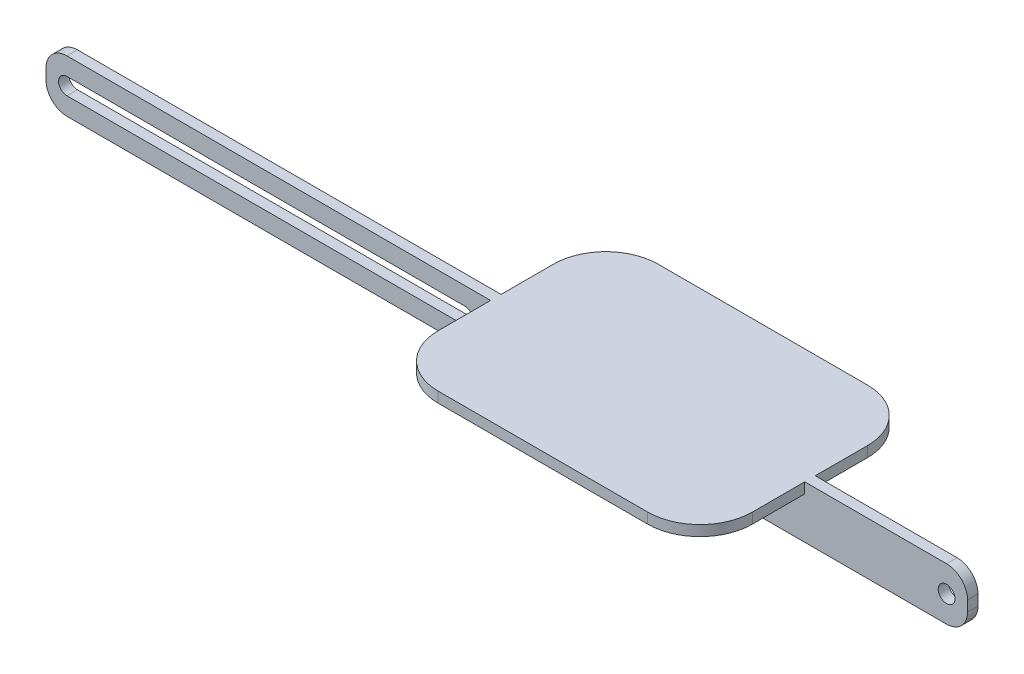
ISO-10303-21;
HEADER;
FILE_DESCRIPTION(('STEP AP214'),'2;1');
FILE_NAME('part.step','',(''),(''),'','','');
FILE_SCHEMA(('AUTOMOTIVE_DESIGN { 1 0 10303 214 1 1 1 1 }'));
ENDSEC;
DATA;
#1=APPLICATION_CONTEXT('core data for automotive mechanical design processes');
#2=APPLICATION_PROTOCOL_DEFINITION('international standard','automotive_design',2000,#1);
#3=PRODUCT_CONTEXT('',#1,'mechanical');
#4=PRODUCT('Part','Part','',(#3));
#5=PRODUCT_RELATED_PRODUCT_CATEGORY('part','',(#4));
#6=PRODUCT_DEFINITION_FORMATION('','',#4);
#7=PRODUCT_DEFINITION_CONTEXT('part definition',#1,'design');
#8=PRODUCT_DEFINITION('design','',#6,#7);
#9=PRODUCT_DEFINITION_SHAPE('','',#8);
#10=(LENGTH_UNIT() NAMED_UNIT(*) SI_UNIT(.MILLI.,.METRE.));
#11=(NAMED_UNIT(*) PLANE_ANGLE_UNIT() SI_UNIT($,.RADIAN.));
#12=(NAMED_UNIT(*) SI_UNIT($,.STERADIAN.) SOLID_ANGLE_UNIT());
#13=UNCERTAINTY_MEASURE_WITH_UNIT(LENGTH_MEASURE(1.E-05),#10,'distance_accuracy_value','');
#14=(GEOMETRIC_REPRESENTATION_CONTEXT(3) GLOBAL_UNCERTAINTY_ASSIGNED_CONTEXT((#13)) GLOBAL_UNIT_ASSIGNED_CONTEXT((#10,
#11,#12)) REPRESENTATION_CONTEXT('',''));
#15=CARTESIAN_POINT('',(0.,0.,0.));
#16=DIRECTION('',(0.,0.,1.));
#17=DIRECTION('',(1.,0.,0.));
#18=AXIS2_PLACEMENT_3D('',#15,#16,#17);
#19=CARTESIAN_POINT('',(53.3332747335424,2.49999999999998,5.));
#20=DIRECTION('',(0.,0.,1.));
#21=DIRECTION('',(1.,0.,0.));
#22=AXIS2_PLACEMENT_3D('',#19,#20,#21);
#23=PLANE('',#22);
#24=DIRECTION('',(0.,1.,0.));
#25=VECTOR('',#24,1.);
#26=CARTESIAN_POINT('',(-14.38994378085,2.49999999999998,5.));
#27=LINE('',#26,#25);
#28=CARTESIAN_POINT('',(-14.38994378085,7.5,5.));
#29=VERTEX_POINT('',#28);
#30=CARTESIAN_POINT('',(-14.38994378085,12.5,5.));
#31=VERTEX_POINT('',#30);
#32=EDGE_CURVE('E205',#29,#31,#27,.T.);
#33=ORIENTED_EDGE('',*,*,#32,.F.);
#34=DIRECTION('',(1.,0.,0.));
#35=VECTOR('',#34,1.);
#36=CARTESIAN_POINT('',(53.3332747335424,7.5,5.));
#37=LINE('',#36,#35);
#38=CARTESIAN_POINT('',(-164.38994378085,7.5,5.));
#39=VERTEX_POINT('',#38);
#40=EDGE_CURVE('E199',#39,#29,#37,.T.);
#41=ORIENTED_EDGE('',*,*,#40,.F.);
#42=DIRECTION('',(0.,-1.,0.));
#43=VECTOR('',#42,1.);
#44=CARTESIAN_POINT('',(-164.38994378085,2.49999999999998,5.));
#45=LINE('',#44,#43);
#46=CARTESIAN_POINT('',(-164.38994378085,12.5,5.));
#47=VERTEX_POINT('',#46);
#48=EDGE_CURVE('E202',#47,#39,#45,.T.);
#49=ORIENTED_EDGE('',*,*,#48,.F.);
#50=DIRECTION('',(-1.,0.,0.));
#51=VECTOR('',#50,1.);
#52=CARTESIAN_POINT('',(-126.666725266458,12.5,5.));
#53=LINE('',#52,#51);
#54=CARTESIAN_POINT('',(-366.666725266458,12.5,5.));
#55=VERTEX_POINT('',#54);
#56=EDGE_CURVE('E281',#47,#55,#53,.T.);
#57=ORIENTED_EDGE('',*,*,#56,.T.);
#58=CARTESIAN_POINT('',(-366.666725266458,2.49999999999999,5.));
#59=DIRECTION('',(0.,0.,1.));
#60=DIRECTION('',(-1.,0.,0.));
#61=AXIS2_PLACEMENT_3D('',#58,#59,#60);
#62=CIRCLE('',#61,10.);
#63=CARTESIAN_POINT('',(-376.666725266458,2.49999999999999,5.));
#64=VERTEX_POINT('',#63);
#65=EDGE_CURVE('E280',#55,#64,#62,.T.);
#66=ORIENTED_EDGE('',*,*,#65,.T.);
#67=DIRECTION('',(0.,-1.,0.));
#68=VECTOR('',#67,1.);
#69=CARTESIAN_POINT('',(-376.666725266458,2.49999999999999,5.));
#70=LINE('',#69,#68);
#71=CARTESIAN_POINT('',(-376.666725266458,-2.49999999999999,5.));
#72=VERTEX_POINT('',#71);
#73=EDGE_CURVE('E283',#64,#72,#70,.T.);
#74=ORIENTED_EDGE('',*,*,#73,.T.);
#75=CARTESIAN_POINT('',(-366.666725266458,-2.49999999999999,5.));
#76=DIRECTION('',(0.,0.,1.));
#77=DIRECTION('',(1.,0.,0.));
#78=AXIS2_PLACEMENT_3D('',#75,#76,#77);
#79=CIRCLE('',#78,10.);
#80=CARTESIAN_POINT('',(-366.666725266458,-12.5,5.));
#81=VERTEX_POINT('',#80);
#82=EDGE_CURVE('E285',#72,#81,#79,.T.);
#83=ORIENTED_EDGE('',*,*,#82,.T.);
#84=DIRECTION('',(1.,0.,0.));
#85=VECTOR('',#84,1.);
#86=CARTESIAN_POINT('',(-366.666725266458,-12.5,5.));
#87=LINE('',#86,#85);
#88=CARTESIAN_POINT('',(53.3332747335424,-12.5,5.));
#89=VERTEX_POINT('',#88);
#90=EDGE_CURVE('E287',#81,#89,#87,.T.);
#91=ORIENTED_EDGE('',*,*,#90,.T.);
#92=CARTESIAN_POINT('',(53.3332747335424,-2.49999999999998,5.));
#93=DIRECTION('',(0.,0.,1.));
#94=DIRECTION('',(-1.,0.,0.));
#95=AXIS2_PLACEMENT_3D('',#92,#93,#94);
#96=CIRCLE('',#95,10.);
#97=CARTESIAN_POINT('',(63.3332747335424,-2.49999999999999,5.));
#98=VERTEX_POINT('',#97);
#99=EDGE_CURVE('E289',#89,#98,#96,.T.);
#100=ORIENTED_EDGE('',*,*,#99,.T.);
#101=DIRECTION('',(0.,1.,0.));
#102=VECTOR('',#101,1.);
#103=CARTESIAN_POINT('',(63.3332747335424,2.49999999999999,5.));
#104=LINE('',#103,#102);
#105=CARTESIAN_POINT('',(63.3332747335424,2.49999999999999,5.));
#106=VERTEX_POINT('',#105);
#107=EDGE_CURVE('E291',#98,#106,#104,.T.);
#108=ORIENTED_EDGE('',*,*,#107,.T.);
#109=CARTESIAN_POINT('',(53.3332747335424,2.49999999999998,5.));
#110=DIRECTION('',(0.,0.,1.));
#111=DIRECTION('',(1.,0.,0.));
#112=AXIS2_PLACEMENT_3D('',#109,#110,#111);
#113=CIRCLE('',#112,10.);
#114=CARTESIAN_POINT('',(53.3332747335424,12.5,5.));
#115=VERTEX_POINT('',#114);
#116=EDGE_CURVE('E293',#106,#115,#113,.T.);
#117=ORIENTED_EDGE('',*,*,#116,.T.);
#118=EDGE_CURVE('E278',#115,#31,#53,.T.);
#119=ORIENTED_EDGE('',*,*,#118,.T.);
#120=EDGE_LOOP('',(#33,#41,#49,#57,#66,#74,#83,#91,#100,#108,#117,#119));
#121=FACE_BOUND('',#120,.T.);
#122=CARTESIAN_POINT('',(53.3332747335424,0.,5.));
#123=DIRECTION('',(0.,0.,1.));
#124=DIRECTION('',(-1.,0.,0.));
#125=AXIS2_PLACEMENT_3D('',#122,#123,#124);
#126=CIRCLE('',#125,4.00000000000001);
#127=CARTESIAN_POINT('',(49.3332747335424,0.,5.));
#128=VERTEX_POINT('',#127);
#129=EDGE_CURVE('E272',#128,#128,#126,.T.);
#130=ORIENTED_EDGE('',*,*,#129,.F.);
#131=EDGE_LOOP('',(#130));
#132=FACE_BOUND('',#131,.T.);
#133=DIRECTION('',(1.,0.,0.));
#134=VECTOR('',#133,1.);
#135=CARTESIAN_POINT('',(-366.666725266458,-4.,5.));
#136=LINE('',#135,#134);
#137=CARTESIAN_POINT('',(-366.666725266458,-4.,5.));
#138=VERTEX_POINT('',#137);
#139=CARTESIAN_POINT('',(-176.666725266458,-4.,5.));
#140=VERTEX_POINT('',#139);
#141=EDGE_CURVE('E243',#138,#140,#136,.T.);
#142=ORIENTED_EDGE('',*,*,#141,.F.);
#143=CARTESIAN_POINT('',(-366.666725266458,0.,5.));
#144=DIRECTION('',(0.,0.,1.));
#145=DIRECTION('',(1.,0.,0.));
#146=AXIS2_PLACEMENT_3D('',#143,#144,#145);
#147=CIRCLE('',#146,4.);
#148=CARTESIAN_POINT('',(-366.666725266458,4.,5.));
#149=VERTEX_POINT('',#148);
#150=EDGE_CURVE('E241',#149,#138,#147,.T.);
#151=ORIENTED_EDGE('',*,*,#150,.F.);
#152=DIRECTION('',(-1.,0.,0.));
#153=VECTOR('',#152,1.);
#154=CARTESIAN_POINT('',(-366.666725266458,4.,5.));
#155=LINE('',#154,#153);
#156=CARTESIAN_POINT('',(-176.666725266458,4.,5.));
#157=VERTEX_POINT('',#156);
#158=EDGE_CURVE('E249',#157,#149,#155,.T.);
#159=ORIENTED_EDGE('',*,*,#158,.F.);
#160=CARTESIAN_POINT('',(-176.666725266458,0.,5.));
#161=DIRECTION('',(0.,0.,1.));
#162=DIRECTION('',(1.,0.,0.));
#163=AXIS2_PLACEMENT_3D('',#160,#161,#162);
#164=CIRCLE('',#163,4.);
#165=EDGE_CURVE('E246',#140,#157,#164,.T.);
#166=ORIENTED_EDGE('',*,*,#165,.F.);
#167=EDGE_LOOP('',(#142,#151,#159,#166));
#168=FACE_BOUND('',#167,.T.);
#169=ADVANCED_FACE('F37',(#121,#132,#168),#23,.T.);
#170=CARTESIAN_POINT('',(53.3332747335424,2.49999999999998,0.));
#171=DIRECTION('',(0.,0.,1.));
#172=DIRECTION('',(1.,0.,0.));
#173=AXIS2_PLACEMENT_3D('',#170,#171,#172);
#174=PLANE('',#173);
#175=CARTESIAN_POINT('',(53.3332747335424,0.,0.));
#176=DIRECTION('',(0.,0.,1.));
#177=DIRECTION('',(-1.,0.,0.));
#178=AXIS2_PLACEMENT_3D('',#175,#176,#177);
#179=CIRCLE('',#178,4.00000000000001);
#180=CARTESIAN_POINT('',(49.3332747335424,0.,0.));
#181=VERTEX_POINT('',#180);
#182=EDGE_CURVE('E271',#181,#181,#179,.T.);
#183=ORIENTED_EDGE('',*,*,#182,.T.);
#184=EDGE_LOOP('',(#183));
#185=FACE_BOUND('',#184,.T.);
#186=DIRECTION('',(1.,0.,0.));
#187=VECTOR('',#186,1.);
#188=CARTESIAN_POINT('',(53.3332747335424,7.5,0.));
#189=LINE('',#188,#187);
#190=CARTESIAN_POINT('',(-164.38994378085,7.5,0.));
#191=VERTEX_POINT('',#190);
#192=CARTESIAN_POINT('',(-14.38994378085,7.5,0.));
#193=VERTEX_POINT('',#192);
#194=EDGE_CURVE('E338',#191,#193,#189,.T.);
#195=ORIENTED_EDGE('',*,*,#194,.T.);
#196=DIRECTION('',(0.,1.,0.));
#197=VECTOR('',#196,1.);
#198=CARTESIAN_POINT('',(-14.38994378085,2.49999999999998,0.));
#199=LINE('',#198,#197);
#200=CARTESIAN_POINT('',(-14.38994378085,12.5,0.));
#201=VERTEX_POINT('',#200);
#202=EDGE_CURVE('E220',#193,#201,#199,.T.);
#203=ORIENTED_EDGE('',*,*,#202,.T.);
#204=DIRECTION('',(-1.,0.,0.));
#205=VECTOR('',#204,1.);
#206=CARTESIAN_POINT('',(-366.666725266458,12.5,0.));
#207=LINE('',#206,#205);
#208=CARTESIAN_POINT('',(53.3332747335424,12.5,0.));
#209=VERTEX_POINT('',#208);
#210=EDGE_CURVE('E296',#209,#201,#207,.T.);
#211=ORIENTED_EDGE('',*,*,#210,.F.);
#212=CARTESIAN_POINT('',(53.3332747335424,2.49999999999998,0.));
#213=DIRECTION('',(0.,0.,1.));
#214=DIRECTION('',(1.,0.,0.));
#215=AXIS2_PLACEMENT_3D('',#212,#213,#214);
#216=CIRCLE('',#215,10.);
#217=CARTESIAN_POINT('',(63.3332747335424,2.49999999999999,0.));
#218=VERTEX_POINT('',#217);
#219=EDGE_CURVE('E312',#218,#209,#216,.T.);
#220=ORIENTED_EDGE('',*,*,#219,.F.);
#221=DIRECTION('',(0.,1.,0.));
#222=VECTOR('',#221,1.);
#223=CARTESIAN_POINT('',(63.3332747335424,2.49999999999999,0.));
#224=LINE('',#223,#222);
#225=CARTESIAN_POINT('',(63.3332747335424,-2.49999999999999,0.));
#226=VERTEX_POINT('',#225);
#227=EDGE_CURVE('E310',#226,#218,#224,.T.);
#228=ORIENTED_EDGE('',*,*,#227,.F.);
#229=CARTESIAN_POINT('',(53.3332747335424,-2.49999999999998,0.));
#230=DIRECTION('',(0.,0.,1.));
#231=DIRECTION('',(-1.,0.,0.));
#232=AXIS2_PLACEMENT_3D('',#229,#230,#231);
#233=CIRCLE('',#232,10.);
#234=CARTESIAN_POINT('',(53.3332747335424,-12.5,0.));
#235=VERTEX_POINT('',#234);
#236=EDGE_CURVE('E308',#235,#226,#233,.T.);
#237=ORIENTED_EDGE('',*,*,#236,.F.);
#238=DIRECTION('',(1.,0.,0.));
#239=VECTOR('',#238,1.);
#240=CARTESIAN_POINT('',(-126.666725266458,-12.5,0.));
#241=LINE('',#240,#239);
#242=CARTESIAN_POINT('',(-366.666725266458,-12.5,0.));
#243=VERTEX_POINT('',#242);
#244=EDGE_CURVE('E306',#243,#235,#241,.T.);
#245=ORIENTED_EDGE('',*,*,#244,.F.);
#246=CARTESIAN_POINT('',(-366.666725266458,-2.49999999999999,0.));
#247=DIRECTION('',(0.,0.,1.));
#248=DIRECTION('',(1.,0.,0.));
#249=AXIS2_PLACEMENT_3D('',#246,#247,#248);
#250=CIRCLE('',#249,10.);
#251=CARTESIAN_POINT('',(-376.666725266458,-2.49999999999999,0.));
#252=VERTEX_POINT('',#251);
#253=EDGE_CURVE('E303',#252,#243,#250,.T.);
#254=ORIENTED_EDGE('',*,*,#253,.F.);
#255=DIRECTION('',(0.,-1.,0.));
#256=VECTOR('',#255,1.);
#257=CARTESIAN_POINT('',(-376.666725266458,2.49999999999999,0.));
#258=LINE('',#257,#256);
#259=CARTESIAN_POINT('',(-376.666725266458,2.49999999999999,0.));
#260=VERTEX_POINT('',#259);
#261=EDGE_CURVE('E301',#260,#252,#258,.T.);
#262=ORIENTED_EDGE('',*,*,#261,.F.);
#263=CARTESIAN_POINT('',(-366.666725266458,2.49999999999999,0.));
#264=DIRECTION('',(0.,0.,1.));
#265=DIRECTION('',(-1.,0.,0.));
#266=AXIS2_PLACEMENT_3D('',#263,#264,#265);
#267=CIRCLE('',#266,10.);
#268=CARTESIAN_POINT('',(-366.666725266458,12.5,0.));
#269=VERTEX_POINT('',#268);
#270=EDGE_CURVE('E299',#269,#260,#267,.T.);
#271=ORIENTED_EDGE('',*,*,#270,.F.);
#272=CARTESIAN_POINT('',(-164.38994378085,12.5,0.));
#273=VERTEX_POINT('',#272);
#274=EDGE_CURVE('E275',#273,#269,#207,.T.);
#275=ORIENTED_EDGE('',*,*,#274,.F.);
#276=DIRECTION('',(0.,-1.,0.));
#277=VECTOR('',#276,1.);
#278=CARTESIAN_POINT('',(-164.38994378085,2.49999999999998,0.));
#279=LINE('',#278,#277);
#280=EDGE_CURVE('E221',#273,#191,#279,.T.);
#281=ORIENTED_EDGE('',*,*,#280,.T.);
#282=EDGE_LOOP('',(#195,#203,#211,#220,#228,#237,#245,#254,#262,#271,#275,#281));
#283=FACE_BOUND('',#282,.T.);
#284=CARTESIAN_POINT('',(-366.666725266458,0.,0.));
#285=DIRECTION('',(0.,0.,1.));
#286=DIRECTION('',(1.,0.,0.));
#287=AXIS2_PLACEMENT_3D('',#284,#285,#286);
#288=CIRCLE('',#287,4.);
#289=CARTESIAN_POINT('',(-366.666725266458,4.,0.));
#290=VERTEX_POINT('',#289);
#291=CARTESIAN_POINT('',(-366.666725266458,-4.,0.));
#292=VERTEX_POINT('',#291);
#293=EDGE_CURVE('E210',#290,#292,#288,.T.);
#294=ORIENTED_EDGE('',*,*,#293,.T.);
#295=DIRECTION('',(1.,0.,0.));
#296=VECTOR('',#295,1.);
#297=CARTESIAN_POINT('',(-366.666725266458,-4.,0.));
#298=LINE('',#297,#296);
#299=CARTESIAN_POINT('',(-176.666725266458,-4.,0.));
#300=VERTEX_POINT('',#299);
#301=EDGE_CURVE('E254',#292,#300,#298,.T.);
#302=ORIENTED_EDGE('',*,*,#301,.T.);
#303=CARTESIAN_POINT('',(-176.666725266458,0.,0.));
#304=DIRECTION('',(0.,0.,1.));
#305=DIRECTION('',(1.,0.,0.));
#306=AXIS2_PLACEMENT_3D('',#303,#304,#305);
#307=CIRCLE('',#306,4.);
#308=CARTESIAN_POINT('',(-176.666725266458,4.,0.));
#309=VERTEX_POINT('',#308);
#310=EDGE_CURVE('E257',#300,#309,#307,.T.);
#311=ORIENTED_EDGE('',*,*,#310,.T.);
#312=DIRECTION('',(-1.,0.,0.));
#313=VECTOR('',#312,1.);
#314=CARTESIAN_POINT('',(-366.666725266458,4.,0.));
#315=LINE('',#314,#313);
#316=EDGE_CURVE('E244',#309,#290,#315,.T.);
#317=ORIENTED_EDGE('',*,*,#316,.T.);
#318=EDGE_LOOP('',(#294,#302,#311,#317));
#319=FACE_BOUND('',#318,.T.);
#320=ADVANCED_FACE('F392',(#185,#283,#319),#174,.F.);
#321=CARTESIAN_POINT('',(-366.666725266458,12.5,5.));
#322=DIRECTION('',(0.,-1.,0.));
#323=DIRECTION('',(1.,0.,0.));
#324=AXIS2_PLACEMENT_3D('',#321,#322,#323);
#325=PLANE('',#324);
#326=DIRECTION('',(0.,0.,1.));
#327=VECTOR('',#326,1.);
#328=CARTESIAN_POINT('',(-164.38994378085,12.5,-50.));
#329=LINE('',#328,#327);
#330=CARTESIAN_POINT('',(-164.38994378085,12.5,30.));
#331=VERTEX_POINT('',#330);
#332=EDGE_CURVE('E219',#47,#331,#329,.T.);
#333=ORIENTED_EDGE('',*,*,#332,.T.);
#334=CARTESIAN_POINT('',(-139.38994378085,12.5,30.));
#335=DIRECTION('',(0.,-1.,0.));
#336=DIRECTION('',(1.,0.,0.));
#337=AXIS2_PLACEMENT_3D('',#334,#335,#336);
#338=CIRCLE('',#337,25.);
#339=CARTESIAN_POINT('',(-139.38994378085,12.5,55.));
#340=VERTEX_POINT('',#339);
#341=EDGE_CURVE('E358',#331,#340,#338,.F.);
#342=ORIENTED_EDGE('',*,*,#341,.T.);
#343=DIRECTION('',(-1.,0.,0.));
#344=VECTOR('',#343,1.);
#345=CARTESIAN_POINT('',(-164.38994378085,12.5,55.));
#346=LINE('',#345,#344);
#347=CARTESIAN_POINT('',(-39.38994378085,12.5,55.));
#348=VERTEX_POINT('',#347);
#349=EDGE_CURVE('E413',#348,#340,#346,.T.);
#350=ORIENTED_EDGE('',*,*,#349,.F.);
#351=CARTESIAN_POINT('',(-39.38994378085,12.5,30.));
#352=DIRECTION('',(0.,-1.,0.));
#353=DIRECTION('',(1.,0.,0.));
#354=AXIS2_PLACEMENT_3D('',#351,#352,#353);
#355=CIRCLE('',#354,25.);
#356=CARTESIAN_POINT('',(-14.38994378085,12.5,30.));
#357=VERTEX_POINT('',#356);
#358=EDGE_CURVE('E356',#348,#357,#355,.F.);
#359=ORIENTED_EDGE('',*,*,#358,.T.);
#360=DIRECTION('',(0.,0.,1.));
#361=VECTOR('',#360,1.);
#362=CARTESIAN_POINT('',(-14.38994378085,12.5,-50.));
#363=LINE('',#362,#361);
#364=EDGE_CURVE('E418',#31,#357,#363,.T.);
#365=ORIENTED_EDGE('',*,*,#364,.F.);
#366=ORIENTED_EDGE('',*,*,#118,.F.);
#367=DIRECTION('',(0.,0.,-1.));
#368=VECTOR('',#367,1.);
#369=CARTESIAN_POINT('',(53.3332747335424,12.5,5.));
#370=LINE('',#369,#368);
#371=EDGE_CURVE('E295',#115,#209,#370,.T.);
#372=ORIENTED_EDGE('',*,*,#371,.T.);
#373=ORIENTED_EDGE('',*,*,#210,.T.);
#374=CARTESIAN_POINT('',(-14.38994378085,12.5,-25.));
#375=VERTEX_POINT('',#374);
#376=EDGE_CURVE('E236',#375,#201,#363,.T.);
#377=ORIENTED_EDGE('',*,*,#376,.F.);
#378=CARTESIAN_POINT('',(-39.38994378085,12.5,-25.));
#379=DIRECTION('',(0.,-1.,0.));
#380=DIRECTION('',(1.,0.,0.));
#381=AXIS2_PLACEMENT_3D('',#378,#379,#380);
#382=CIRCLE('',#381,25.);
#383=CARTESIAN_POINT('',(-39.38994378085,12.5,-50.));
#384=VERTEX_POINT('',#383);
#385=EDGE_CURVE('E352',#375,#384,#382,.F.);
#386=ORIENTED_EDGE('',*,*,#385,.T.);
#387=DIRECTION('',(-1.,0.,0.));
#388=VECTOR('',#387,1.);
#389=CARTESIAN_POINT('',(-164.38994378085,12.5,-50.));
#390=LINE('',#389,#388);
#391=CARTESIAN_POINT('',(-139.38994378085,12.5,-50.));
#392=VERTEX_POINT('',#391);
#393=EDGE_CURVE('E371',#384,#392,#390,.T.);
#394=ORIENTED_EDGE('',*,*,#393,.T.);
#395=CARTESIAN_POINT('',(-139.38994378085,12.5,-25.));
#396=DIRECTION('',(0.,-1.,0.));
#397=DIRECTION('',(1.,0.,0.));
#398=AXIS2_PLACEMENT_3D('',#395,#396,#397);
#399=CIRCLE('',#398,25.);
#400=CARTESIAN_POINT('',(-164.38994378085,12.5,-25.));
#401=VERTEX_POINT('',#400);
#402=EDGE_CURVE('E354',#392,#401,#399,.F.);
#403=ORIENTED_EDGE('',*,*,#402,.T.);
#404=EDGE_CURVE('E227',#401,#273,#329,.T.);
#405=ORIENTED_EDGE('',*,*,#404,.T.);
#406=ORIENTED_EDGE('',*,*,#274,.T.);
#407=DIRECTION('',(0.,0.,-1.));
#408=VECTOR('',#407,1.);
#409=CARTESIAN_POINT('',(-366.666725266458,12.5,5.));
#410=LINE('',#409,#408);
#411=EDGE_CURVE('E335',#55,#269,#410,.T.);
#412=ORIENTED_EDGE('',*,*,#411,.F.);
#413=ORIENTED_EDGE('',*,*,#56,.F.);
#414=EDGE_LOOP('',(#333,#342,#350,#359,#365,#366,#372,#373,#377,#386,#394,#403,#405,#406,#412,#413));
#415=FACE_BOUND('',#414,.T.);
#416=ADVANCED_FACE('F376',(#415),#325,.F.);
#417=CARTESIAN_POINT('',(-366.666725266458,2.49999999999999,5.));
#418=DIRECTION('',(0.,0.,-1.));
#419=DIRECTION('',(-1.,0.,0.));
#420=AXIS2_PLACEMENT_3D('',#417,#418,#419);
#421=CYLINDRICAL_SURFACE('',#420,10.);
#422=ORIENTED_EDGE('',*,*,#270,.T.);
#423=DIRECTION('',(0.,0.,-1.));
#424=VECTOR('',#423,1.);
#425=CARTESIAN_POINT('',(-376.666725266458,2.49999999999999,5.));
#426=LINE('',#425,#424);
#427=EDGE_CURVE('E332',#64,#260,#426,.T.);
#428=ORIENTED_EDGE('',*,*,#427,.F.);
#429=ORIENTED_EDGE('',*,*,#65,.F.);
#430=ORIENTED_EDGE('',*,*,#411,.T.);
#431=EDGE_LOOP('',(#422,#428,#429,#430));
#432=FACE_BOUND('',#431,.T.);
#433=ADVANCED_FACE('F399',(#432),#421,.T.);
#434=CARTESIAN_POINT('',(-376.666725266458,2.49999999999999,5.));
#435=DIRECTION('',(1.,0.,0.));
#436=DIRECTION('',(0.,0.,-1.));
#437=AXIS2_PLACEMENT_3D('',#434,#435,#436);
#438=PLANE('',#437);
#439=ORIENTED_EDGE('',*,*,#261,.T.);
#440=DIRECTION('',(0.,0.,-1.));
#441=VECTOR('',#440,1.);
#442=CARTESIAN_POINT('',(-376.666725266458,-2.49999999999999,5.));
#443=LINE('',#442,#441);
#444=EDGE_CURVE('E329',#72,#252,#443,.T.);
#445=ORIENTED_EDGE('',*,*,#444,.F.);
#446=ORIENTED_EDGE('',*,*,#73,.F.);
#447=ORIENTED_EDGE('',*,*,#427,.T.);
#448=EDGE_LOOP('',(#439,#445,#446,#447));
#449=FACE_BOUND('',#448,.T.);
#450=ADVANCED_FACE('F469',(#449),#438,.F.);
#451=CARTESIAN_POINT('',(-366.666725266458,-2.49999999999999,5.));
#452=DIRECTION('',(0.,0.,-1.));
#453=DIRECTION('',(-1.,0.,0.));
#454=AXIS2_PLACEMENT_3D('',#451,#452,#453);
#455=CYLINDRICAL_SURFACE('',#454,10.);
#456=ORIENTED_EDGE('',*,*,#253,.T.);
#457=DIRECTION('',(0.,0.,-1.));
#458=VECTOR('',#457,1.);
#459=CARTESIAN_POINT('',(-366.666725266458,-12.5,5.));
#460=LINE('',#459,#458);
#461=EDGE_CURVE('E326',#81,#243,#460,.T.);
#462=ORIENTED_EDGE('',*,*,#461,.F.);
#463=ORIENTED_EDGE('',*,*,#82,.F.);
#464=ORIENTED_EDGE('',*,*,#444,.T.);
#465=EDGE_LOOP('',(#456,#462,#463,#464));
#466=FACE_BOUND('',#465,.T.);
#467=ADVANCED_FACE('F465',(#466),#455,.T.);
#468=CARTESIAN_POINT('',(-126.666725266458,-12.5,5.));
#469=DIRECTION('',(0.,1.,0.));
#470=DIRECTION('',(-1.,0.,0.));
#471=AXIS2_PLACEMENT_3D('',#468,#469,#470);
#472=PLANE('',#471);
#473=ORIENTED_EDGE('',*,*,#244,.T.);
#474=DIRECTION('',(0.,0.,-1.));
#475=VECTOR('',#474,1.);
#476=CARTESIAN_POINT('',(53.3332747335424,-12.5,5.));
#477=LINE('',#476,#475);
#478=EDGE_CURVE('E323',#89,#235,#477,.T.);
#479=ORIENTED_EDGE('',*,*,#478,.F.);
#480=ORIENTED_EDGE('',*,*,#90,.F.);
#481=ORIENTED_EDGE('',*,*,#461,.T.);
#482=EDGE_LOOP('',(#473,#479,#480,#481));
#483=FACE_BOUND('',#482,.T.);
#484=ADVANCED_FACE('F461',(#483),#472,.F.);
#485=CARTESIAN_POINT('',(53.3332747335424,-2.49999999999998,5.));
#486=DIRECTION('',(0.,0.,-1.));
#487=DIRECTION('',(-1.,0.,0.));
#488=AXIS2_PLACEMENT_3D('',#485,#486,#487);
#489=CYLINDRICAL_SURFACE('',#488,10.);
#490=ORIENTED_EDGE('',*,*,#236,.T.);
#491=DIRECTION('',(0.,0.,-1.));
#492=VECTOR('',#491,1.);
#493=CARTESIAN_POINT('',(63.3332747335424,-2.49999999999999,5.));
#494=LINE('',#493,#492);
#495=EDGE_CURVE('E320',#98,#226,#494,.T.);
#496=ORIENTED_EDGE('',*,*,#495,.F.);
#497=ORIENTED_EDGE('',*,*,#99,.F.);
#498=ORIENTED_EDGE('',*,*,#478,.T.);
#499=EDGE_LOOP('',(#490,#496,#497,#498));
#500=FACE_BOUND('',#499,.T.);
#501=ADVANCED_FACE('F457',(#500),#489,.T.);
#502=CARTESIAN_POINT('',(63.3332747335424,2.49999999999999,5.));
#503=DIRECTION('',(-1.,0.,0.));
#504=DIRECTION('',(0.,0.,1.));
#505=AXIS2_PLACEMENT_3D('',#502,#503,#504);
#506=PLANE('',#505);
#507=ORIENTED_EDGE('',*,*,#227,.T.);
#508=DIRECTION('',(0.,0.,-1.));
#509=VECTOR('',#508,1.);
#510=CARTESIAN_POINT('',(63.3332747335424,2.49999999999999,5.));
#511=LINE('',#510,#509);
#512=EDGE_CURVE('E317',#106,#218,#511,.T.);
#513=ORIENTED_EDGE('',*,*,#512,.F.);
#514=ORIENTED_EDGE('',*,*,#107,.F.);
#515=ORIENTED_EDGE('',*,*,#495,.T.);
#516=EDGE_LOOP('',(#507,#513,#514,#515));
#517=FACE_BOUND('',#516,.T.);
#518=ADVANCED_FACE('F453',(#517),#506,.F.);
#519=CARTESIAN_POINT('',(53.3332747335424,2.49999999999998,5.));
#520=DIRECTION('',(0.,0.,-1.));
#521=DIRECTION('',(-1.,0.,0.));
#522=AXIS2_PLACEMENT_3D('',#519,#520,#521);
#523=CYLINDRICAL_SURFACE('',#522,10.);
#524=ORIENTED_EDGE('',*,*,#219,.T.);
#525=ORIENTED_EDGE('',*,*,#371,.F.);
#526=ORIENTED_EDGE('',*,*,#116,.F.);
#527=ORIENTED_EDGE('',*,*,#512,.T.);
#528=EDGE_LOOP('',(#524,#525,#526,#527));
#529=FACE_BOUND('',#528,.T.);
#530=ADVANCED_FACE('F450',(#529),#523,.T.);
#531=CARTESIAN_POINT('',(53.3332747335424,0.,5.));
#532=DIRECTION('',(0.,0.,-1.));
#533=DIRECTION('',(-1.,0.,0.));
#534=AXIS2_PLACEMENT_3D('',#531,#532,#533);
#535=CYLINDRICAL_SURFACE('',#534,4.00000000000001);
#536=ORIENTED_EDGE('',*,*,#129,.T.);
#537=EDGE_LOOP('',(#536));
#538=FACE_BOUND('',#537,.T.);
#539=ORIENTED_EDGE('',*,*,#182,.F.);
#540=EDGE_LOOP('',(#539));
#541=FACE_BOUND('',#540,.T.);
#542=ADVANCED_FACE('F447',(#538,#541),#535,.F.);
#543=CARTESIAN_POINT('',(-366.666725266458,0.,5.));
#544=DIRECTION('',(0.,0.,-1.));
#545=DIRECTION('',(-1.,0.,0.));
#546=AXIS2_PLACEMENT_3D('',#543,#544,#545);
#547=CYLINDRICAL_SURFACE('',#546,4.);
#548=ORIENTED_EDGE('',*,*,#293,.F.);
#549=DIRECTION('',(0.,0.,-1.));
#550=VECTOR('',#549,1.);
#551=CARTESIAN_POINT('',(-366.666725266458,4.,5.));
#552=LINE('',#551,#550);
#553=EDGE_CURVE('E251',#149,#290,#552,.T.);
#554=ORIENTED_EDGE('',*,*,#553,.F.);
#555=ORIENTED_EDGE('',*,*,#150,.T.);
#556=DIRECTION('',(0.,0.,-1.));
#557=VECTOR('',#556,1.);
#558=CARTESIAN_POINT('',(-366.666725266458,-4.,5.));
#559=LINE('',#558,#557);
#560=EDGE_CURVE('E268',#138,#292,#559,.T.);
#561=ORIENTED_EDGE('',*,*,#560,.T.);
#562=EDGE_LOOP('',(#548,#554,#555,#561));
#563=FACE_BOUND('',#562,.T.);
#564=ADVANCED_FACE('F618',(#563),#547,.F.);
#565=CARTESIAN_POINT('',(-366.666725266458,-4.,5.));
#566=DIRECTION('',(0.,1.,0.));
#567=DIRECTION('',(-1.,0.,0.));
#568=AXIS2_PLACEMENT_3D('',#565,#566,#567);
#569=PLANE('',#568);
#570=ORIENTED_EDGE('',*,*,#301,.F.);
#571=ORIENTED_EDGE('',*,*,#560,.F.);
#572=ORIENTED_EDGE('',*,*,#141,.T.);
#573=DIRECTION('',(0.,0.,-1.));
#574=VECTOR('',#573,1.);
#575=CARTESIAN_POINT('',(-176.666725266458,-4.,5.));
#576=LINE('',#575,#574);
#577=EDGE_CURVE('E266',#140,#300,#576,.T.);
#578=ORIENTED_EDGE('',*,*,#577,.T.);
#579=EDGE_LOOP('',(#570,#571,#572,#578));
#580=FACE_BOUND('',#579,.T.);
#581=ADVANCED_FACE('F608',(#580),#569,.T.);
#582=CARTESIAN_POINT('',(-176.666725266458,0.,5.));
#583=DIRECTION('',(0.,0.,-1.));
#584=DIRECTION('',(-1.,0.,0.));
#585=AXIS2_PLACEMENT_3D('',#582,#583,#584);
#586=CYLINDRICAL_SURFACE('',#585,4.);
#587=ORIENTED_EDGE('',*,*,#310,.F.);
#588=ORIENTED_EDGE('',*,*,#577,.F.);
#589=ORIENTED_EDGE('',*,*,#165,.T.);
#590=DIRECTION('',(0.,0.,-1.));
#591=VECTOR('',#590,1.);
#592=CARTESIAN_POINT('',(-176.666725266458,4.,5.));
#593=LINE('',#592,#591);
#594=EDGE_CURVE('E264',#157,#309,#593,.T.);
#595=ORIENTED_EDGE('',*,*,#594,.T.);
#596=EDGE_LOOP('',(#587,#588,#589,#595));
#597=FACE_BOUND('',#596,.T.);
#598=ADVANCED_FACE('F598',(#597),#586,.F.);
#599=CARTESIAN_POINT('',(-366.666725266458,4.,5.));
#600=DIRECTION('',(0.,-1.,0.));
#601=DIRECTION('',(1.,0.,0.));
#602=AXIS2_PLACEMENT_3D('',#599,#600,#601);
#603=PLANE('',#602);
#604=ORIENTED_EDGE('',*,*,#316,.F.);
#605=ORIENTED_EDGE('',*,*,#594,.F.);
#606=ORIENTED_EDGE('',*,*,#158,.T.);
#607=ORIENTED_EDGE('',*,*,#553,.T.);
#608=EDGE_LOOP('',(#604,#605,#606,#607));
#609=FACE_BOUND('',#608,.T.);
#610=ADVANCED_FACE('F572',(#609),#603,.T.);
#611=CARTESIAN_POINT('',(0.,0.,-50.));
#612=DIRECTION('',(0.,0.,-1.));
#613=DIRECTION('',(-1.,0.,0.));
#614=AXIS2_PLACEMENT_3D('',#611,#612,#613);
#615=PLANE('',#614);
#616=DIRECTION('',(1.,0.,0.));
#617=VECTOR('',#616,1.);
#618=CARTESIAN_POINT('',(-164.38994378085,7.5,-50.));
#619=LINE('',#618,#617);
#620=CARTESIAN_POINT('',(-139.38994378085,7.5,-50.));
#621=VERTEX_POINT('',#620);
#622=CARTESIAN_POINT('',(-39.38994378085,7.5,-50.));
#623=VERTEX_POINT('',#622);
#624=EDGE_CURVE('E372',#621,#623,#619,.T.);
#625=ORIENTED_EDGE('',*,*,#624,.F.);
#626=DIRECTION('',(0.,-1.,0.));
#627=VECTOR('',#626,1.);
#628=CARTESIAN_POINT('',(-139.38994378085,0.,-50.));
#629=LINE('',#628,#627);
#630=EDGE_CURVE('E45',#621,#392,#629,.F.);
#631=ORIENTED_EDGE('',*,*,#630,.T.);
#632=ORIENTED_EDGE('',*,*,#393,.F.);
#633=DIRECTION('',(0.,1.,0.));
#634=VECTOR('',#633,1.);
#635=CARTESIAN_POINT('',(-39.38994378085,0.,-50.));
#636=LINE('',#635,#634);
#637=EDGE_CURVE('E60',#384,#623,#636,.F.);
#638=ORIENTED_EDGE('',*,*,#637,.T.);
#639=EDGE_LOOP('',(#625,#631,#632,#638));
#640=FACE_BOUND('',#639,.T.);
#641=ADVANCED_FACE('F370',(#640),#615,.T.);
#642=CARTESIAN_POINT('',(-164.38994378085,12.5,-50.));
#643=DIRECTION('',(-1.,0.,0.));
#644=DIRECTION('',(0.,0.,1.));
#645=AXIS2_PLACEMENT_3D('',#642,#643,#644);
#646=PLANE('',#645);
#647=ORIENTED_EDGE('',*,*,#404,.F.);
#648=DIRECTION('',(0.,-1.,0.));
#649=VECTOR('',#648,1.);
#650=CARTESIAN_POINT('',(-164.38994378085,12.5,-25.));
#651=LINE('',#650,#649);
#652=CARTESIAN_POINT('',(-164.38994378085,7.5,-25.));
#653=VERTEX_POINT('',#652);
#654=EDGE_CURVE('E362',#401,#653,#651,.T.);
#655=ORIENTED_EDGE('',*,*,#654,.T.);
#656=DIRECTION('',(0.,0.,1.));
#657=VECTOR('',#656,1.);
#658=CARTESIAN_POINT('',(-164.38994378085,7.5,-50.));
#659=LINE('',#658,#657);
#660=EDGE_CURVE('E226',#653,#191,#659,.T.);
#661=ORIENTED_EDGE('',*,*,#660,.T.);
#662=ORIENTED_EDGE('',*,*,#280,.F.);
#663=EDGE_LOOP('',(#647,#655,#661,#662));
#664=FACE_BOUND('',#663,.T.);
#665=ADVANCED_FACE('F385',(#664),#646,.T.);
#666=CARTESIAN_POINT('',(-164.38994378085,7.5,-50.));
#667=DIRECTION('',(0.,-1.,0.));
#668=DIRECTION('',(0.,0.,-1.));
#669=AXIS2_PLACEMENT_3D('',#666,#667,#668);
#670=PLANE('',#669);
#671=ORIENTED_EDGE('',*,*,#660,.F.);
#672=CARTESIAN_POINT('',(-139.38994378085,7.5,-25.));
#673=DIRECTION('',(0.,-1.,0.));
#674=DIRECTION('',(0.,0.,-1.));
#675=AXIS2_PLACEMENT_3D('',#672,#673,#674);
#676=CIRCLE('',#675,25.);
#677=EDGE_CURVE('E366',#653,#621,#676,.T.);
#678=ORIENTED_EDGE('',*,*,#677,.T.);
#679=ORIENTED_EDGE('',*,*,#624,.T.);
#680=CARTESIAN_POINT('',(-39.38994378085,7.5,-25.));
#681=DIRECTION('',(0.,-1.,0.));
#682=DIRECTION('',(0.,0.,-1.));
#683=AXIS2_PLACEMENT_3D('',#680,#681,#682);
#684=CIRCLE('',#683,25.);
#685=CARTESIAN_POINT('',(-14.38994378085,7.5,-25.));
#686=VERTEX_POINT('',#685);
#687=EDGE_CURVE('E52',#623,#686,#684,.T.);
#688=ORIENTED_EDGE('',*,*,#687,.T.);
#689=DIRECTION('',(0.,0.,1.));
#690=VECTOR('',#689,1.);
#691=CARTESIAN_POINT('',(-14.38994378085,7.5,-50.));
#692=LINE('',#691,#690);
#693=EDGE_CURVE('E232',#686,#193,#692,.T.);
#694=ORIENTED_EDGE('',*,*,#693,.T.);
#695=ORIENTED_EDGE('',*,*,#194,.F.);
#696=EDGE_LOOP('',(#671,#678,#679,#688,#694,#695));
#697=FACE_BOUND('',#696,.T.);
#698=ADVANCED_FACE('F388',(#697),#670,.T.);
#699=CARTESIAN_POINT('',(-14.38994378085,12.5,-50.));
#700=DIRECTION('',(1.,0.,0.));
#701=DIRECTION('',(0.,0.,-1.));
#702=AXIS2_PLACEMENT_3D('',#699,#700,#701);
#703=PLANE('',#702);
#704=ORIENTED_EDGE('',*,*,#693,.F.);
#705=DIRECTION('',(0.,1.,0.));
#706=VECTOR('',#705,1.);
#707=CARTESIAN_POINT('',(-14.38994378085,12.5,-25.));
#708=LINE('',#707,#706);
#709=EDGE_CURVE('E11',#686,#375,#708,.T.);
#710=ORIENTED_EDGE('',*,*,#709,.T.);
#711=ORIENTED_EDGE('',*,*,#376,.T.);
#712=ORIENTED_EDGE('',*,*,#202,.F.);
#713=EDGE_LOOP('',(#704,#710,#711,#712));
#714=FACE_BOUND('',#713,.T.);
#715=ADVANCED_FACE('F431',(#714),#703,.T.);
#716=ORIENTED_EDGE('',*,*,#364,.T.);
#717=DIRECTION('',(0.,1.,0.));
#718=VECTOR('',#717,1.);
#719=CARTESIAN_POINT('',(-14.38994378085,7.5,30.));
#720=LINE('',#719,#718);
#721=CARTESIAN_POINT('',(-14.38994378085,7.5,30.));
#722=VERTEX_POINT('',#721);
#723=EDGE_CURVE('E360',#357,#722,#720,.F.);
#724=ORIENTED_EDGE('',*,*,#723,.T.);
#725=EDGE_CURVE('E229',#29,#722,#692,.T.);
#726=ORIENTED_EDGE('',*,*,#725,.F.);
#727=ORIENTED_EDGE('',*,*,#32,.T.);
#728=EDGE_LOOP('',(#716,#724,#726,#727));
#729=FACE_BOUND('',#728,.T.);
#730=ADVANCED_FACE('F429',(#729),#703,.T.);
#731=DIRECTION('',(1.,0.,0.));
#732=VECTOR('',#731,1.);
#733=CARTESIAN_POINT('',(-164.38994378085,7.5,55.));
#734=LINE('',#733,#732);
#735=CARTESIAN_POINT('',(-139.38994378085,7.5,55.));
#736=VERTEX_POINT('',#735);
#737=CARTESIAN_POINT('',(-39.38994378085,7.5,55.));
#738=VERTEX_POINT('',#737);
#739=EDGE_CURVE('E379',#736,#738,#734,.T.);
#740=ORIENTED_EDGE('',*,*,#739,.F.);
#741=CARTESIAN_POINT('',(-139.38994378085,7.5,30.));
#742=DIRECTION('',(0.,-1.,0.));
#743=DIRECTION('',(0.,0.,-1.));
#744=AXIS2_PLACEMENT_3D('',#741,#742,#743);
#745=CIRCLE('',#744,25.);
#746=CARTESIAN_POINT('',(-164.38994378085,7.5,30.));
#747=VERTEX_POINT('',#746);
#748=EDGE_CURVE('E225',#736,#747,#745,.T.);
#749=ORIENTED_EDGE('',*,*,#748,.T.);
#750=EDGE_CURVE('E216',#39,#747,#659,.T.);
#751=ORIENTED_EDGE('',*,*,#750,.F.);
#752=ORIENTED_EDGE('',*,*,#40,.T.);
#753=ORIENTED_EDGE('',*,*,#725,.T.);
#754=CARTESIAN_POINT('',(-39.38994378085,7.5,30.));
#755=DIRECTION('',(0.,-1.,0.));
#756=DIRECTION('',(0.,0.,-1.));
#757=AXIS2_PLACEMENT_3D('',#754,#755,#756);
#758=CIRCLE('',#757,25.);
#759=EDGE_CURVE('E347',#722,#738,#758,.T.);
#760=ORIENTED_EDGE('',*,*,#759,.T.);
#761=EDGE_LOOP('',(#740,#749,#751,#752,#753,#760));
#762=FACE_BOUND('',#761,.T.);
#763=ADVANCED_FACE('F224',(#762),#670,.T.);
#764=ORIENTED_EDGE('',*,*,#750,.T.);
#765=DIRECTION('',(0.,-1.,0.));
#766=VECTOR('',#765,1.);
#767=CARTESIAN_POINT('',(-164.38994378085,12.5,30.));
#768=LINE('',#767,#766);
#769=EDGE_CURVE('E350',#747,#331,#768,.F.);
#770=ORIENTED_EDGE('',*,*,#769,.T.);
#771=ORIENTED_EDGE('',*,*,#332,.F.);
#772=ORIENTED_EDGE('',*,*,#48,.T.);
#773=EDGE_LOOP('',(#764,#770,#771,#772));
#774=FACE_BOUND('',#773,.T.);
#775=ADVANCED_FACE('F215',(#774),#646,.T.);
#776=CARTESIAN_POINT('',(0.,0.,55.));
#777=DIRECTION('',(0.,0.,-1.));
#778=DIRECTION('',(-1.,0.,0.));
#779=AXIS2_PLACEMENT_3D('',#776,#777,#778);
#780=PLANE('',#779);
#781=ORIENTED_EDGE('',*,*,#349,.T.);
#782=DIRECTION('',(0.,-1.,0.));
#783=VECTOR('',#782,1.);
#784=CARTESIAN_POINT('',(-139.38994378085,7.5,55.));
#785=LINE('',#784,#783);
#786=EDGE_CURVE('E344',#340,#736,#785,.T.);
#787=ORIENTED_EDGE('',*,*,#786,.T.);
#788=ORIENTED_EDGE('',*,*,#739,.T.);
#789=DIRECTION('',(0.,1.,0.));
#790=VECTOR('',#789,1.);
#791=CARTESIAN_POINT('',(-39.38994378085,12.5,55.));
#792=LINE('',#791,#790);
#793=EDGE_CURVE('E341',#738,#348,#792,.T.);
#794=ORIENTED_EDGE('',*,*,#793,.T.);
#795=EDGE_LOOP('',(#781,#787,#788,#794));
#796=FACE_BOUND('',#795,.T.);
#797=ADVANCED_FACE('F411',(#796),#780,.F.);
#798=CARTESIAN_POINT('',(-139.38994378085,0.,30.));
#799=DIRECTION('',(0.,1.,0.));
#800=DIRECTION('',(0.,0.,1.));
#801=AXIS2_PLACEMENT_3D('',#798,#799,#800);
#802=CYLINDRICAL_SURFACE('',#801,25.);
#803=ORIENTED_EDGE('',*,*,#341,.F.);
#804=ORIENTED_EDGE('',*,*,#769,.F.);
#805=ORIENTED_EDGE('',*,*,#748,.F.);
#806=ORIENTED_EDGE('',*,*,#786,.F.);
#807=EDGE_LOOP('',(#803,#804,#805,#806));
#808=FACE_BOUND('',#807,.T.);
#809=ADVANCED_FACE('F408',(#808),#802,.T.);
#810=CARTESIAN_POINT('',(-39.38994378085,0.,30.));
#811=DIRECTION('',(0.,-1.,0.));
#812=DIRECTION('',(0.,0.,-1.));
#813=AXIS2_PLACEMENT_3D('',#810,#811,#812);
#814=CYLINDRICAL_SURFACE('',#813,25.);
#815=ORIENTED_EDGE('',*,*,#759,.F.);
#816=ORIENTED_EDGE('',*,*,#723,.F.);
#817=ORIENTED_EDGE('',*,*,#358,.F.);
#818=ORIENTED_EDGE('',*,*,#793,.F.);
#819=EDGE_LOOP('',(#815,#816,#817,#818));
#820=FACE_BOUND('',#819,.T.);
#821=ADVANCED_FACE('F425',(#820),#814,.T.);
#822=CARTESIAN_POINT('',(-139.38994378085,12.5,-25.));
#823=DIRECTION('',(0.,-1.,0.));
#824=DIRECTION('',(0.,0.,-1.));
#825=AXIS2_PLACEMENT_3D('',#822,#823,#824);
#826=CYLINDRICAL_SURFACE('',#825,25.);
#827=ORIENTED_EDGE('',*,*,#402,.F.);
#828=ORIENTED_EDGE('',*,*,#630,.F.);
#829=ORIENTED_EDGE('',*,*,#677,.F.);
#830=ORIENTED_EDGE('',*,*,#654,.F.);
#831=EDGE_LOOP('',(#827,#828,#829,#830));
#832=FACE_BOUND('',#831,.T.);
#833=ADVANCED_FACE('F382',(#832),#826,.T.);
#834=CARTESIAN_POINT('',(-39.38994378085,12.5,-25.));
#835=DIRECTION('',(0.,1.,0.));
#836=DIRECTION('',(0.,0.,1.));
#837=AXIS2_PLACEMENT_3D('',#834,#835,#836);
#838=CYLINDRICAL_SURFACE('',#837,25.);
#839=ORIENTED_EDGE('',*,*,#687,.F.);
#840=ORIENTED_EDGE('',*,*,#637,.F.);
#841=ORIENTED_EDGE('',*,*,#385,.F.);
#842=ORIENTED_EDGE('',*,*,#709,.F.);
#843=EDGE_LOOP('',(#839,#840,#841,#842));
#844=FACE_BOUND('',#843,.T.);
#845=ADVANCED_FACE('F39',(#844),#838,.T.);
#846=CLOSED_SHELL('',(#169,#320,#416,#433,#450,#467,#484,#501,#518,#530,#542,#564,#581,#598,
#610,#641,#665,#698,#715,#730,#763,#775,#797,#809,#821,#833,#845));
#847=MANIFOLD_SOLID_BREP('B2',#846);
#848=ADVANCED_BREP_SHAPE_REPRESENTATION('',(#18,#847),#14);
#849=SHAPE_DEFINITION_REPRESENTATION(#9,#848);
ENDSEC;
END-ISO-10303-21;
